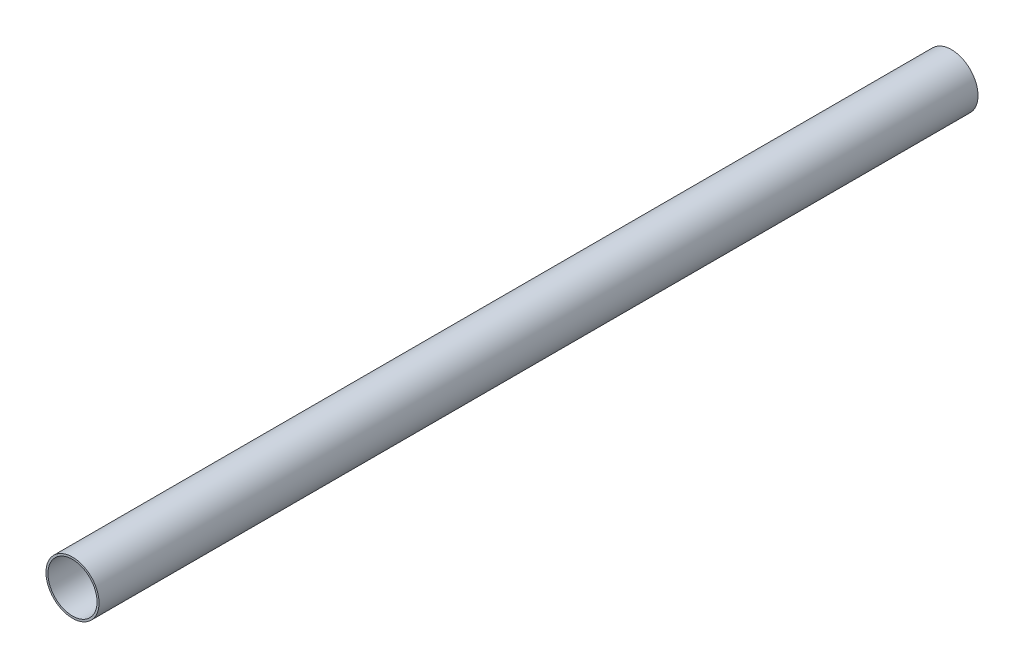
ISO-10303-21;
HEADER;
FILE_DESCRIPTION(('STEP AP214'),'2;1');
FILE_NAME('part.step','',(''),(''),'','','');
FILE_SCHEMA(('AUTOMOTIVE_DESIGN { 1 0 10303 214 1 1 1 1 }'));
ENDSEC;
DATA;
#1=APPLICATION_CONTEXT('core data for automotive mechanical design processes');
#2=APPLICATION_PROTOCOL_DEFINITION('international standard','automotive_design',2000,#1);
#3=PRODUCT_CONTEXT('',#1,'mechanical');
#4=PRODUCT('Part','Part','',(#3));
#5=PRODUCT_RELATED_PRODUCT_CATEGORY('part','',(#4));
#6=PRODUCT_DEFINITION_FORMATION('','',#4);
#7=PRODUCT_DEFINITION_CONTEXT('part definition',#1,'design');
#8=PRODUCT_DEFINITION('design','',#6,#7);
#9=PRODUCT_DEFINITION_SHAPE('','',#8);
#10=(LENGTH_UNIT() NAMED_UNIT(*) SI_UNIT(.MILLI.,.METRE.));
#11=(NAMED_UNIT(*) PLANE_ANGLE_UNIT() SI_UNIT($,.RADIAN.));
#12=(NAMED_UNIT(*) SI_UNIT($,.STERADIAN.) SOLID_ANGLE_UNIT());
#13=UNCERTAINTY_MEASURE_WITH_UNIT(LENGTH_MEASURE(1.E-05),#10,'distance_accuracy_value','');
#14=(GEOMETRIC_REPRESENTATION_CONTEXT(3) GLOBAL_UNCERTAINTY_ASSIGNED_CONTEXT((#13)) GLOBAL_UNIT_ASSIGNED_CONTEXT((#10,
#11,#12)) REPRESENTATION_CONTEXT('',''));
#15=CARTESIAN_POINT('',(0.,0.,0.));
#16=DIRECTION('',(0.,0.,1.));
#17=DIRECTION('',(1.,0.,0.));
#18=AXIS2_PLACEMENT_3D('',#15,#16,#17);
#19=CARTESIAN_POINT('',(0.,0.,265.));
#20=DIRECTION('',(0.,0.,1.));
#21=DIRECTION('',(1.,0.,0.));
#22=AXIS2_PLACEMENT_3D('',#19,#20,#21);
#23=PLANE('',#22);
#24=CARTESIAN_POINT('',(0.,0.,265.));
#25=DIRECTION('',(0.,0.,1.));
#26=DIRECTION('',(1.,0.,0.));
#27=AXIS2_PLACEMENT_3D('',#24,#25,#26);
#28=CIRCLE('',#27,8.);
#29=CARTESIAN_POINT('',(8.,0.,265.));
#30=VERTEX_POINT('',#29);
#31=EDGE_CURVE('E12',#30,#30,#28,.T.);
#32=ORIENTED_EDGE('',*,*,#31,.T.);
#33=EDGE_LOOP('',(#32));
#34=FACE_BOUND('',#33,.T.);
#35=CARTESIAN_POINT('',(0.,0.,265.));
#36=DIRECTION('',(0.,0.,1.));
#37=DIRECTION('',(1.,0.,0.));
#38=AXIS2_PLACEMENT_3D('',#35,#36,#37);
#39=CIRCLE('',#38,7.4);
#40=CARTESIAN_POINT('',(7.4,0.,265.));
#41=VERTEX_POINT('',#40);
#42=EDGE_CURVE('E50',#41,#41,#39,.T.);
#43=ORIENTED_EDGE('',*,*,#42,.F.);
#44=EDGE_LOOP('',(#43));
#45=FACE_BOUND('',#44,.T.);
#46=ADVANCED_FACE('F39',(#34,#45),#23,.T.);
#47=CARTESIAN_POINT('',(0.,0.,0.));
#48=DIRECTION('',(0.,0.,1.));
#49=DIRECTION('',(1.,0.,0.));
#50=AXIS2_PLACEMENT_3D('',#47,#48,#49);
#51=PLANE('',#50);
#52=CARTESIAN_POINT('',(0.,0.,0.));
#53=DIRECTION('',(0.,0.,1.));
#54=DIRECTION('',(1.,0.,0.));
#55=AXIS2_PLACEMENT_3D('',#52,#53,#54);
#56=CIRCLE('',#55,8.);
#57=CARTESIAN_POINT('',(8.,0.,0.));
#58=VERTEX_POINT('',#57);
#59=EDGE_CURVE('E43',#58,#58,#56,.T.);
#60=ORIENTED_EDGE('',*,*,#59,.F.);
#61=EDGE_LOOP('',(#60));
#62=FACE_BOUND('',#61,.T.);
#63=CARTESIAN_POINT('',(0.,0.,0.));
#64=DIRECTION('',(0.,0.,1.));
#65=DIRECTION('',(1.,0.,0.));
#66=AXIS2_PLACEMENT_3D('',#63,#64,#65);
#67=CIRCLE('',#66,7.4);
#68=CARTESIAN_POINT('',(7.4,0.,0.));
#69=VERTEX_POINT('',#68);
#70=EDGE_CURVE('E52',#69,#69,#67,.T.);
#71=ORIENTED_EDGE('',*,*,#70,.T.);
#72=EDGE_LOOP('',(#71));
#73=FACE_BOUND('',#72,.T.);
#74=ADVANCED_FACE('F62',(#62,#73),#51,.F.);
#75=CARTESIAN_POINT('',(0.,0.,265.));
#76=DIRECTION('',(0.,0.,-1.));
#77=DIRECTION('',(-1.,0.,0.));
#78=AXIS2_PLACEMENT_3D('',#75,#76,#77);
#79=CYLINDRICAL_SURFACE('',#78,8.);
#80=ORIENTED_EDGE('',*,*,#31,.F.);
#81=EDGE_LOOP('',(#80));
#82=FACE_BOUND('',#81,.T.);
#83=ORIENTED_EDGE('',*,*,#59,.T.);
#84=EDGE_LOOP('',(#83));
#85=FACE_BOUND('',#84,.T.);
#86=ADVANCED_FACE('F41',(#82,#85),#79,.T.);
#87=CARTESIAN_POINT('',(0.,0.,265.));
#88=DIRECTION('',(0.,0.,-1.));
#89=DIRECTION('',(-1.,0.,0.));
#90=AXIS2_PLACEMENT_3D('',#87,#88,#89);
#91=CYLINDRICAL_SURFACE('',#90,7.4);
#92=ORIENTED_EDGE('',*,*,#42,.T.);
#93=EDGE_LOOP('',(#92));
#94=FACE_BOUND('',#93,.T.);
#95=ORIENTED_EDGE('',*,*,#70,.F.);
#96=EDGE_LOOP('',(#95));
#97=FACE_BOUND('',#96,.T.);
#98=ADVANCED_FACE('F58',(#94,#97),#91,.F.);
#99=CLOSED_SHELL('',(#46,#74,#86,#98));
#100=MANIFOLD_SOLID_BREP('B2',#99);
#101=ADVANCED_BREP_SHAPE_REPRESENTATION('',(#18,#100),#14);
#102=SHAPE_DEFINITION_REPRESENTATION(#9,#101);
ENDSEC;
END-ISO-10303-21;
